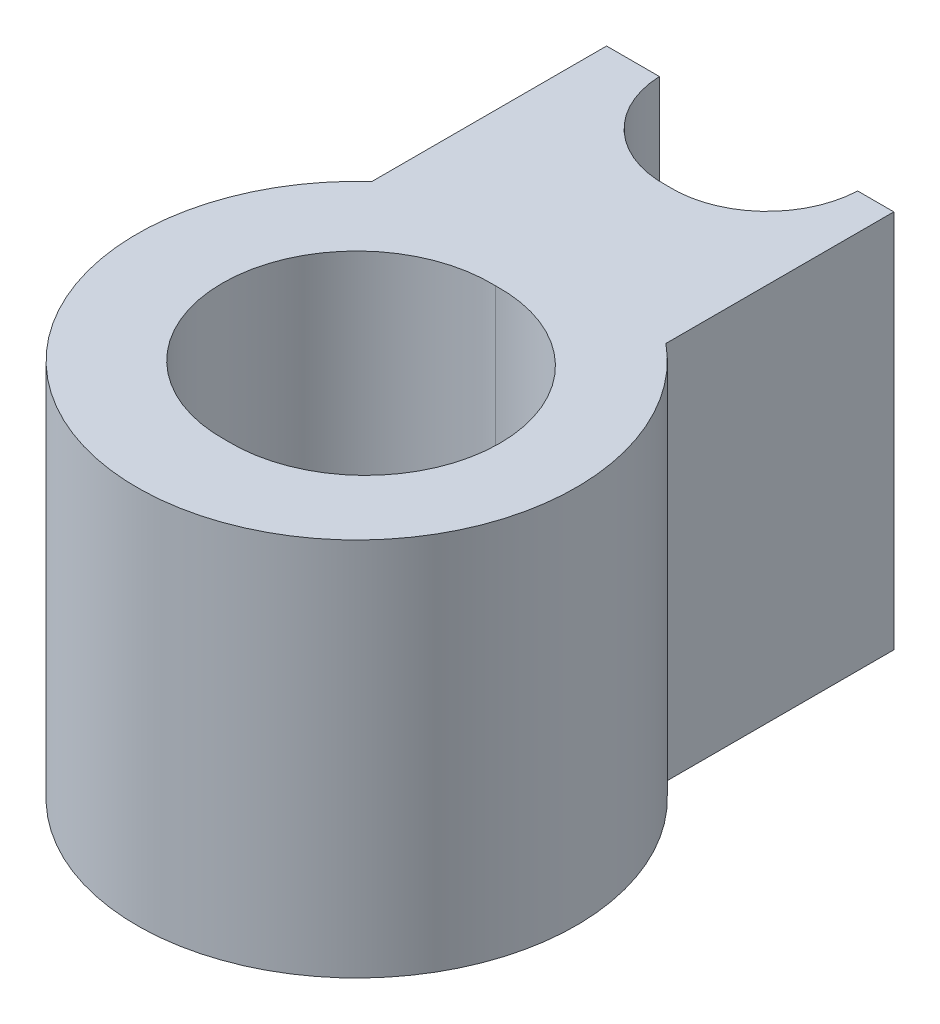
ISO-10303-21;
HEADER;
FILE_DESCRIPTION(('STEP AP214'),'2;1');
FILE_NAME('part.step','',(''),(''),'','','');
FILE_SCHEMA(('AUTOMOTIVE_DESIGN { 1 0 10303 214 1 1 1 1 }'));
ENDSEC;
DATA;
#1=APPLICATION_CONTEXT('core data for automotive mechanical design processes');
#2=APPLICATION_PROTOCOL_DEFINITION('international standard','automotive_design',2000,#1);
#3=PRODUCT_CONTEXT('',#1,'mechanical');
#4=PRODUCT('Part','Part','',(#3));
#5=PRODUCT_RELATED_PRODUCT_CATEGORY('part','',(#4));
#6=PRODUCT_DEFINITION_FORMATION('','',#4);
#7=PRODUCT_DEFINITION_CONTEXT('part definition',#1,'design');
#8=PRODUCT_DEFINITION('design','',#6,#7);
#9=PRODUCT_DEFINITION_SHAPE('','',#8);
#10=(LENGTH_UNIT() NAMED_UNIT(*) SI_UNIT(.MILLI.,.METRE.));
#11=(NAMED_UNIT(*) PLANE_ANGLE_UNIT() SI_UNIT($,.RADIAN.));
#12=(NAMED_UNIT(*) SI_UNIT($,.STERADIAN.) SOLID_ANGLE_UNIT());
#13=UNCERTAINTY_MEASURE_WITH_UNIT(LENGTH_MEASURE(1.E-05),#10,'distance_accuracy_value','');
#14=(GEOMETRIC_REPRESENTATION_CONTEXT(3) GLOBAL_UNCERTAINTY_ASSIGNED_CONTEXT((#13)) GLOBAL_UNIT_ASSIGNED_CONTEXT((#10,
#11,#12)) REPRESENTATION_CONTEXT('',''));
#15=CARTESIAN_POINT('',(0.,0.,0.));
#16=DIRECTION('',(0.,0.,1.));
#17=DIRECTION('',(1.,0.,0.));
#18=AXIS2_PLACEMENT_3D('',#15,#16,#17);
#19=CARTESIAN_POINT('',(1.26536763995187,2.87183105039429,15.59112871048));
#20=DIRECTION('',(0.,1.,0.));
#21=DIRECTION('',(0.,0.,-1.));
#22=AXIS2_PLACEMENT_3D('',#19,#20,#21);
#23=PLANE('',#22);
#24=CARTESIAN_POINT('',(-6.44353236004814,2.87183105039428,7.9584287104753));
#25=DIRECTION('',(0.,1.,0.));
#26=DIRECTION('',(0.,0.,1.));
#27=AXIS2_PLACEMENT_3D('',#24,#25,#26);
#28=CIRCLE('',#27,0.425);
#29=CARTESIAN_POINT('',(-6.45738203218777,2.87183105039428,8.38320298768807));
#30=VERTEX_POINT('',#29);
#31=CARTESIAN_POINT('',(-6.45738203218777,2.87183105039428,7.53365443326253));
#32=VERTEX_POINT('',#31);
#33=EDGE_CURVE('E161',#30,#32,#28,.T.);
#34=ORIENTED_EDGE('',*,*,#33,.F.);
#35=CARTESIAN_POINT('',(-6.47123170432737,2.87183105039428,7.9584287104753));
#36=DIRECTION('',(0.,1.,0.));
#37=DIRECTION('',(0.,0.,1.));
#38=AXIS2_PLACEMENT_3D('',#35,#36,#37);
#39=CIRCLE('',#38,0.425);
#40=EDGE_CURVE('E198',#32,#30,#39,.T.);
#41=ORIENTED_EDGE('',*,*,#40,.F.);
#42=EDGE_LOOP('',(#34,#41));
#43=FACE_BOUND('',#42,.T.);
#44=DIRECTION('',(-5.02522919053297E-13,0.,1.));
#45=VECTOR('',#44,1.);
#46=CARTESIAN_POINT('',(-6.93804650821001,2.87183105039428,6.70112871047543));
#47=LINE('',#46,#45);
#48=CARTESIAN_POINT('',(-6.93804650821001,2.87183105039428,6.70112871047543));
#49=VERTEX_POINT('',#48);
#50=CARTESIAN_POINT('',(-6.93804650821038,2.87183105039428,7.44378108328629));
#51=VERTEX_POINT('',#50);
#52=EDGE_CURVE('E117',#49,#51,#47,.T.);
#53=ORIENTED_EDGE('',*,*,#52,.T.);
#54=CARTESIAN_POINT('',(-6.47123170432737,2.87183105039428,7.9584287104753));
#55=DIRECTION('',(0.,1.,0.));
#56=DIRECTION('',(0.,0.,1.));
#57=AXIS2_PLACEMENT_3D('',#54,#55,#56);
#58=CIRCLE('',#57,0.694822453073876);
#59=CARTESIAN_POINT('',(-6.0293526154479,2.87183105039428,7.42221875895757));
#60=VERTEX_POINT('',#59);
#61=EDGE_CURVE('E204',#51,#60,#58,.T.);
#62=ORIENTED_EDGE('',*,*,#61,.T.);
#63=DIRECTION('',(5.6636748734305E-13,0.,1.));
#64=VECTOR('',#63,1.);
#65=CARTESIAN_POINT('',(-6.02935261544831,2.87183105039428,6.70112871047504));
#66=LINE('',#65,#64);
#67=CARTESIAN_POINT('',(-6.02935261544831,2.87183105039428,6.70112871047504));
#68=VERTEX_POINT('',#67);
#69=EDGE_CURVE('E26',#68,#60,#66,.T.);
#70=ORIENTED_EDGE('',*,*,#69,.F.);
#71=DIRECTION('',(-1.,0.,1.62432664225037E-12));
#72=VECTOR('',#71,1.);
#73=CARTESIAN_POINT('',(-6.02935261544831,2.87183105039428,6.70112871047504));
#74=LINE('',#73,#72);
#75=CARTESIAN_POINT('',(-6.14380129724813,2.87183105039428,6.70112871047522));
#76=VERTEX_POINT('',#75);
#77=EDGE_CURVE('E11',#68,#76,#74,.T.);
#78=ORIENTED_EDGE('',*,*,#77,.T.);
#79=CARTESIAN_POINT('',(-6.44353236004816,2.87183105039428,6.68842871047527));
#80=DIRECTION('',(0.,1.,0.));
#81=DIRECTION('',(-0.999103542626009,0.,0.0423333333457055));
#82=AXIS2_PLACEMENT_3D('',#79,#80,#81);
#83=CIRCLE('',#82,0.299999999999993);
#84=CARTESIAN_POINT('',(-6.45738203218848,2.87183105039428,6.9881088509278));
#85=VERTEX_POINT('',#84);
#86=EDGE_CURVE('E172',#85,#76,#83,.T.);
#87=ORIENTED_EDGE('',*,*,#86,.F.);
#88=CARTESIAN_POINT('',(-6.47123170432739,2.87183105039428,6.68842871047527));
#89=DIRECTION('',(0.,1.,0.));
#90=DIRECTION('',(-0.999103542626486,0.,0.0423333333344553));
#91=AXIS2_PLACEMENT_3D('',#88,#89,#90);
#92=CIRCLE('',#91,0.299999999999992);
#93=CARTESIAN_POINT('',(-6.77096276711532,2.87183105039428,6.70112871047561));
#94=VERTEX_POINT('',#93);
#95=EDGE_CURVE('E122',#94,#85,#92,.T.);
#96=ORIENTED_EDGE('',*,*,#95,.F.);
#97=DIRECTION('',(1.,0.,1.06337566312106E-12));
#98=VECTOR('',#97,1.);
#99=CARTESIAN_POINT('',(-6.93804650821001,2.87183105039428,6.70112871047543));
#100=LINE('',#99,#98);
#101=EDGE_CURVE('E121',#49,#94,#100,.T.);
#102=ORIENTED_EDGE('',*,*,#101,.F.);
#103=EDGE_LOOP('',(#53,#62,#70,#78,#87,#96,#102));
#104=FACE_BOUND('',#103,.T.);
#105=ADVANCED_FACE('F17',(#43,#104),#23,.T.);
#106=CARTESIAN_POINT('',(-6.14380129724813,2.87183105039428,6.70112871047522));
#107=DIRECTION('',(-1.62432664225037E-12,0.,-1.));
#108=DIRECTION('',(-1.,0.,1.62432664225037E-12));
#109=AXIS2_PLACEMENT_3D('',#106,#107,#108);
#110=PLANE('',#109);
#111=DIRECTION('',(-1.,0.,1.62432664225037E-12));
#112=VECTOR('',#111,1.);
#113=CARTESIAN_POINT('',(-2.43921682865535,1.6718310055699,6.7011287104692));
#114=LINE('',#113,#112);
#115=CARTESIAN_POINT('',(-6.0293526154483,1.6718310055699,6.70112871047504));
#116=VERTEX_POINT('',#115);
#117=CARTESIAN_POINT('',(-6.14380129724812,1.6718310055699,6.70112871047522));
#118=VERTEX_POINT('',#117);
#119=EDGE_CURVE('E152',#116,#118,#114,.T.);
#120=ORIENTED_EDGE('',*,*,#119,.T.);
#121=DIRECTION('',(0.,-1.,0.));
#122=VECTOR('',#121,1.);
#123=CARTESIAN_POINT('',(-6.14380129724813,2.87183105039428,6.70112871047522));
#124=LINE('',#123,#122);
#125=EDGE_CURVE('E169',#76,#118,#124,.T.);
#126=ORIENTED_EDGE('',*,*,#125,.F.);
#127=ORIENTED_EDGE('',*,*,#77,.F.);
#128=DIRECTION('',(0.,-1.,0.));
#129=VECTOR('',#128,1.);
#130=CARTESIAN_POINT('',(-6.02935261544831,2.87183105039428,6.70112871047504));
#131=LINE('',#130,#129);
#132=EDGE_CURVE('E207',#68,#116,#131,.T.);
#133=ORIENTED_EDGE('',*,*,#132,.T.);
#134=EDGE_LOOP('',(#120,#126,#127,#133));
#135=FACE_BOUND('',#134,.T.);
#136=ADVANCED_FACE('F303',(#135),#110,.T.);
#137=CARTESIAN_POINT('',(-6.02935261544831,2.87183105039428,6.70112871047504));
#138=DIRECTION('',(1.,0.,-5.6636748734305E-13));
#139=DIRECTION('',(-5.6636748734305E-13,0.,-1.));
#140=AXIS2_PLACEMENT_3D('',#137,#138,#139);
#141=PLANE('',#140);
#142=DIRECTION('',(-5.6636748734305E-13,0.,-1.));
#143=VECTOR('',#142,1.);
#144=CARTESIAN_POINT('',(-6.02935261544579,1.6718310055699,11.1461287104796));
#145=LINE('',#144,#143);
#146=CARTESIAN_POINT('',(-6.02935261544789,1.6718310055699,7.42221875895757));
#147=VERTEX_POINT('',#146);
#148=EDGE_CURVE('E156',#147,#116,#145,.T.);
#149=ORIENTED_EDGE('',*,*,#148,.T.);
#150=ORIENTED_EDGE('',*,*,#132,.F.);
#151=ORIENTED_EDGE('',*,*,#69,.T.);
#152=DIRECTION('',(0.,-1.,0.));
#153=VECTOR('',#152,1.);
#154=CARTESIAN_POINT('',(-6.0293526154479,2.87183105039428,7.42221875895757));
#155=LINE('',#154,#153);
#156=EDGE_CURVE('E201',#60,#147,#155,.T.);
#157=ORIENTED_EDGE('',*,*,#156,.T.);
#158=EDGE_LOOP('',(#149,#150,#151,#157));
#159=FACE_BOUND('',#158,.T.);
#160=ADVANCED_FACE('F19',(#159),#141,.T.);
#161=CARTESIAN_POINT('',(-6.47123170432737,2.87183105039428,7.9584287104753));
#162=DIRECTION('',(0.,-1.,0.));
#163=DIRECTION('',(0.,0.,1.));
#164=AXIS2_PLACEMENT_3D('',#161,#162,#163);
#165=CYLINDRICAL_SURFACE('',#164,0.694822453073876);
#166=CARTESIAN_POINT('',(-6.47123170432737,1.6718310055699,7.9584287104753));
#167=DIRECTION('',(0.,1.,0.));
#168=DIRECTION('',(0.,0.,1.));
#169=AXIS2_PLACEMENT_3D('',#166,#167,#168);
#170=CIRCLE('',#169,0.694822453073876);
#171=CARTESIAN_POINT('',(-6.93804650821037,1.6718310055699,7.44378108328629));
#172=VERTEX_POINT('',#171);
#173=EDGE_CURVE('E139',#172,#147,#170,.T.);
#174=ORIENTED_EDGE('',*,*,#173,.T.);
#175=ORIENTED_EDGE('',*,*,#156,.F.);
#176=ORIENTED_EDGE('',*,*,#61,.F.);
#177=DIRECTION('',(0.,-1.,0.));
#178=VECTOR('',#177,1.);
#179=CARTESIAN_POINT('',(-6.93804650821038,2.87183105039428,7.44378108328629));
#180=LINE('',#179,#178);
#181=EDGE_CURVE('E193',#51,#172,#180,.T.);
#182=ORIENTED_EDGE('',*,*,#181,.T.);
#183=EDGE_LOOP('',(#174,#175,#176,#182));
#184=FACE_BOUND('',#183,.T.);
#185=ADVANCED_FACE('F306',(#184),#165,.T.);
#186=CARTESIAN_POINT('',(-6.47123170432737,2.87183105039428,7.9584287104753));
#187=DIRECTION('',(0.,-1.,0.));
#188=DIRECTION('',(-1.,0.,0.));
#189=AXIS2_PLACEMENT_3D('',#186,#187,#188);
#190=CYLINDRICAL_SURFACE('',#189,0.425);
#191=CARTESIAN_POINT('',(-6.47123170432737,1.6718310055699,7.9584287104753));
#192=DIRECTION('',(0.,-1.,0.));
#193=DIRECTION('',(0.,0.,1.));
#194=AXIS2_PLACEMENT_3D('',#191,#192,#193);
#195=CIRCLE('',#194,0.425);
#196=CARTESIAN_POINT('',(-6.45738203218776,1.6718310055699,8.38320298768807));
#197=VERTEX_POINT('',#196);
#198=CARTESIAN_POINT('',(-6.45738203218776,1.6718310055699,7.53365443326253));
#199=VERTEX_POINT('',#198);
#200=EDGE_CURVE('E168',#197,#199,#195,.T.);
#201=ORIENTED_EDGE('',*,*,#200,.T.);
#202=DIRECTION('',(0.,-1.,0.));
#203=VECTOR('',#202,1.);
#204=CARTESIAN_POINT('',(-6.45738203218777,2.87183105039428,7.53365443326253));
#205=LINE('',#204,#203);
#206=EDGE_CURVE('E157',#32,#199,#205,.T.);
#207=ORIENTED_EDGE('',*,*,#206,.F.);
#208=ORIENTED_EDGE('',*,*,#40,.T.);
#209=DIRECTION('',(0.,-1.,0.));
#210=VECTOR('',#209,1.);
#211=CARTESIAN_POINT('',(-6.45738203218777,2.87183105039428,8.38320298768807));
#212=LINE('',#211,#210);
#213=EDGE_CURVE('E173',#30,#197,#212,.T.);
#214=ORIENTED_EDGE('',*,*,#213,.T.);
#215=EDGE_LOOP('',(#201,#207,#208,#214));
#216=FACE_BOUND('',#215,.T.);
#217=ADVANCED_FACE('F326',(#216),#190,.F.);
#218=CARTESIAN_POINT('',(-6.93804650821038,2.87183105039428,7.44378108328629));
#219=DIRECTION('',(-1.,0.,-5.02522919053297E-13));
#220=DIRECTION('',(-5.02522919053297E-13,0.,1.));
#221=AXIS2_PLACEMENT_3D('',#218,#219,#220);
#222=PLANE('',#221);
#223=DIRECTION('',(-5.02522919053297E-13,0.,1.));
#224=VECTOR('',#223,1.);
#225=CARTESIAN_POINT('',(-6.93804650821243,1.6718310055699,11.5174548968811));
#226=LINE('',#225,#224);
#227=CARTESIAN_POINT('',(-6.93804650821,1.6718310055699,6.70112871047543));
#228=VERTEX_POINT('',#227);
#229=EDGE_CURVE('E115',#228,#172,#226,.T.);
#230=ORIENTED_EDGE('',*,*,#229,.T.);
#231=ORIENTED_EDGE('',*,*,#181,.F.);
#232=ORIENTED_EDGE('',*,*,#52,.F.);
#233=DIRECTION('',(0.,-1.,0.));
#234=VECTOR('',#233,1.);
#235=CARTESIAN_POINT('',(-6.93804650821001,2.87183105039428,6.70112871047543));
#236=LINE('',#235,#234);
#237=EDGE_CURVE('E110',#49,#228,#236,.T.);
#238=ORIENTED_EDGE('',*,*,#237,.T.);
#239=EDGE_LOOP('',(#230,#231,#232,#238));
#240=FACE_BOUND('',#239,.T.);
#241=ADVANCED_FACE('F112',(#240),#222,.T.);
#242=CARTESIAN_POINT('',(-6.93804650821001,2.87183105039428,6.70112871047543));
#243=DIRECTION('',(1.06337566312106E-12,0.,-1.));
#244=DIRECTION('',(0.,-1.,0.));
#245=AXIS2_PLACEMENT_3D('',#242,#243,#244);
#246=PLANE('',#245);
#247=DIRECTION('',(-1.,0.,-1.06337566312106E-12));
#248=VECTOR('',#247,1.);
#249=CARTESIAN_POINT('',(-2.83633943412434,1.6718310055699,6.70112871047979));
#250=LINE('',#249,#248);
#251=CARTESIAN_POINT('',(-6.77096276711532,1.6718310055699,6.70112871047561));
#252=VERTEX_POINT('',#251);
#253=EDGE_CURVE('E125',#252,#228,#250,.T.);
#254=ORIENTED_EDGE('',*,*,#253,.T.);
#255=ORIENTED_EDGE('',*,*,#237,.F.);
#256=ORIENTED_EDGE('',*,*,#101,.T.);
#257=DIRECTION('',(0.,-1.,0.));
#258=VECTOR('',#257,1.);
#259=CARTESIAN_POINT('',(-6.77096276711532,2.87183105039428,6.70112871047561));
#260=LINE('',#259,#258);
#261=EDGE_CURVE('E128',#94,#252,#260,.T.);
#262=ORIENTED_EDGE('',*,*,#261,.T.);
#263=EDGE_LOOP('',(#254,#255,#256,#262));
#264=FACE_BOUND('',#263,.T.);
#265=ADVANCED_FACE('F126',(#264),#246,.T.);
#266=CARTESIAN_POINT('',(-6.47123170432739,2.87183105039428,6.68842871047527));
#267=DIRECTION('',(0.,-1.,0.));
#268=DIRECTION('',(-0.999103542626486,0.,0.0423333333344553));
#269=AXIS2_PLACEMENT_3D('',#266,#267,#268);
#270=CYLINDRICAL_SURFACE('',#269,0.299999999999992);
#271=CARTESIAN_POINT('',(-6.47123170432739,1.6718310055699,6.68842871047527));
#272=DIRECTION('',(0.,-1.,0.));
#273=DIRECTION('',(-0.999103542626486,0.,0.0423333333344553));
#274=AXIS2_PLACEMENT_3D('',#271,#272,#273);
#275=CIRCLE('',#274,0.299999999999992);
#276=CARTESIAN_POINT('',(-6.45738203218847,1.6718310055699,6.9881088509278));
#277=VERTEX_POINT('',#276);
#278=EDGE_CURVE('E133',#277,#252,#275,.T.);
#279=ORIENTED_EDGE('',*,*,#278,.T.);
#280=ORIENTED_EDGE('',*,*,#261,.F.);
#281=ORIENTED_EDGE('',*,*,#95,.T.);
#282=DIRECTION('',(0.,-1.,0.));
#283=VECTOR('',#282,1.);
#284=CARTESIAN_POINT('',(-6.45738203218848,2.87183105039428,6.9881088509278));
#285=LINE('',#284,#283);
#286=EDGE_CURVE('E160',#85,#277,#285,.T.);
#287=ORIENTED_EDGE('',*,*,#286,.T.);
#288=EDGE_LOOP('',(#279,#280,#281,#287));
#289=FACE_BOUND('',#288,.T.);
#290=ADVANCED_FACE('F296',(#289),#270,.F.);
#291=CARTESIAN_POINT('',(-6.44353236004816,2.87183105039428,6.68842871047527));
#292=DIRECTION('',(0.,-1.,0.));
#293=DIRECTION('',(-0.999103542626009,0.,0.0423333333457054));
#294=AXIS2_PLACEMENT_3D('',#291,#292,#293);
#295=CYLINDRICAL_SURFACE('',#294,0.299999999999993);
#296=CARTESIAN_POINT('',(-6.44353236004816,1.6718310055699,6.68842871047527));
#297=DIRECTION('',(0.,-1.,0.));
#298=DIRECTION('',(-0.999103542626009,0.,0.0423333333457055));
#299=AXIS2_PLACEMENT_3D('',#296,#297,#298);
#300=CIRCLE('',#299,0.299999999999993);
#301=EDGE_CURVE('E148',#118,#277,#300,.T.);
#302=ORIENTED_EDGE('',*,*,#301,.T.);
#303=ORIENTED_EDGE('',*,*,#286,.F.);
#304=ORIENTED_EDGE('',*,*,#86,.T.);
#305=ORIENTED_EDGE('',*,*,#125,.T.);
#306=EDGE_LOOP('',(#302,#303,#304,#305));
#307=FACE_BOUND('',#306,.T.);
#308=ADVANCED_FACE('F301',(#307),#295,.F.);
#309=CARTESIAN_POINT('',(-6.44353236004814,2.87183105039428,7.9584287104753));
#310=DIRECTION('',(0.,-1.,0.));
#311=DIRECTION('',(1.,0.,0.));
#312=AXIS2_PLACEMENT_3D('',#309,#310,#311);
#313=CYLINDRICAL_SURFACE('',#312,0.425);
#314=CARTESIAN_POINT('',(-6.44353236004814,1.6718310055699,7.9584287104753));
#315=DIRECTION('',(0.,-1.,0.));
#316=DIRECTION('',(0.,0.,1.));
#317=AXIS2_PLACEMENT_3D('',#314,#315,#316);
#318=CIRCLE('',#317,0.425);
#319=EDGE_CURVE('E164',#199,#197,#318,.T.);
#320=ORIENTED_EDGE('',*,*,#319,.T.);
#321=ORIENTED_EDGE('',*,*,#213,.F.);
#322=ORIENTED_EDGE('',*,*,#33,.T.);
#323=ORIENTED_EDGE('',*,*,#206,.T.);
#324=EDGE_LOOP('',(#320,#321,#322,#323));
#325=FACE_BOUND('',#324,.T.);
#326=ADVANCED_FACE('F320',(#325),#313,.F.);
#327=CARTESIAN_POINT('',(1.26536763995188,1.6718310055699,15.59112871048));
#328=DIRECTION('',(0.,1.,0.));
#329=DIRECTION('',(0.,0.,-1.));
#330=AXIS2_PLACEMENT_3D('',#327,#328,#329);
#331=PLANE('',#330);
#332=ORIENTED_EDGE('',*,*,#319,.F.);
#333=ORIENTED_EDGE('',*,*,#200,.F.);
#334=EDGE_LOOP('',(#332,#333));
#335=FACE_BOUND('',#334,.T.);
#336=ORIENTED_EDGE('',*,*,#229,.F.);
#337=ORIENTED_EDGE('',*,*,#253,.F.);
#338=ORIENTED_EDGE('',*,*,#278,.F.);
#339=ORIENTED_EDGE('',*,*,#301,.F.);
#340=ORIENTED_EDGE('',*,*,#119,.F.);
#341=ORIENTED_EDGE('',*,*,#148,.F.);
#342=ORIENTED_EDGE('',*,*,#173,.F.);
#343=EDGE_LOOP('',(#336,#337,#338,#339,#340,#341,#342));
#344=FACE_BOUND('',#343,.T.);
#345=ADVANCED_FACE('F136',(#335,#344),#331,.F.);
#346=CLOSED_SHELL('',(#105,#136,#160,#185,#217,#241,#265,#290,#308,#326,#345));
#347=MANIFOLD_SOLID_BREP('B1',#346);
#348=ADVANCED_BREP_SHAPE_REPRESENTATION('',(#18,#347),#14);
#349=SHAPE_DEFINITION_REPRESENTATION(#9,#348);
ENDSEC;
END-ISO-10303-21;
